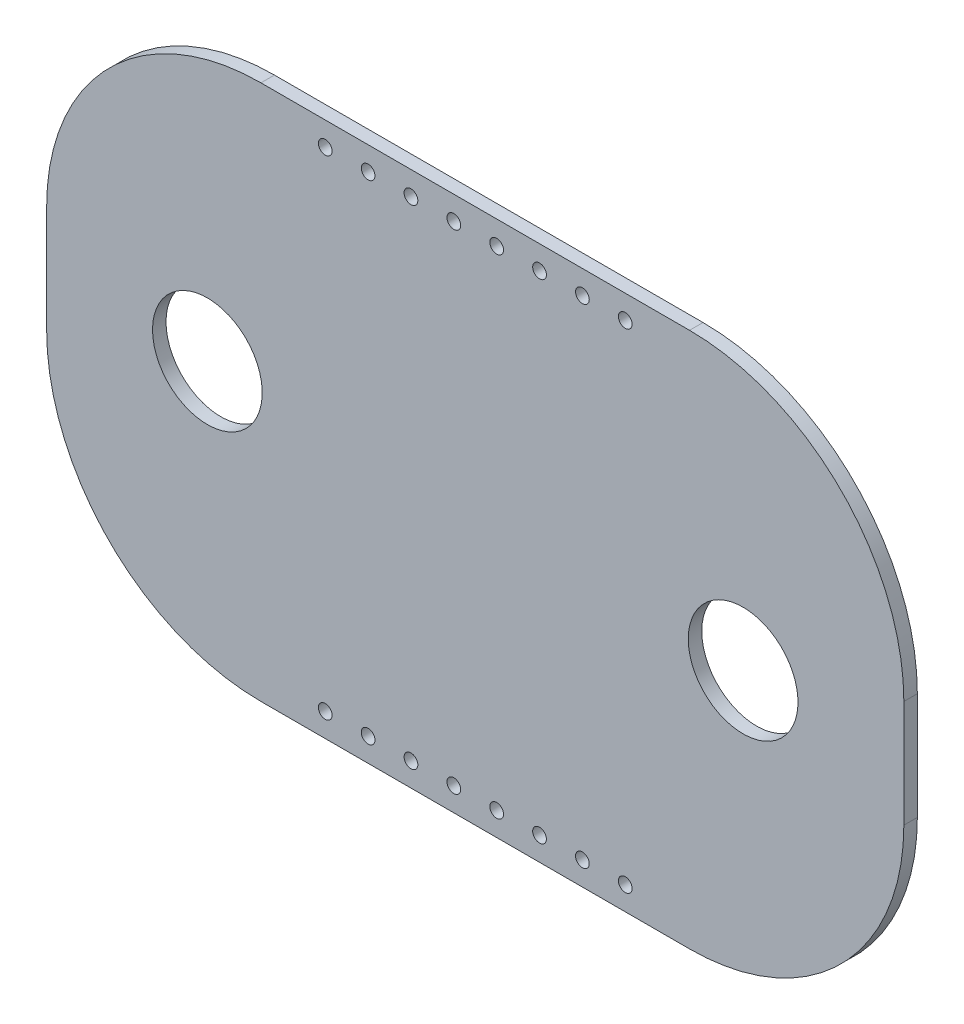
ISO-10303-21;
HEADER;
FILE_DESCRIPTION(('STEP AP214'),'2;1');
FILE_NAME('part.step','',(''),(''),'','','');
FILE_SCHEMA(('AUTOMOTIVE_DESIGN { 1 0 10303 214 1 1 1 1 }'));
ENDSEC;
DATA;
#1=APPLICATION_CONTEXT('core data for automotive mechanical design processes');
#2=APPLICATION_PROTOCOL_DEFINITION('international standard','automotive_design',2000,#1);
#3=PRODUCT_CONTEXT('',#1,'mechanical');
#4=PRODUCT('Part','Part','',(#3));
#5=PRODUCT_RELATED_PRODUCT_CATEGORY('part','',(#4));
#6=PRODUCT_DEFINITION_FORMATION('','',#4);
#7=PRODUCT_DEFINITION_CONTEXT('part definition',#1,'design');
#8=PRODUCT_DEFINITION('design','',#6,#7);
#9=PRODUCT_DEFINITION_SHAPE('','',#8);
#10=(LENGTH_UNIT() NAMED_UNIT(*) SI_UNIT(.MILLI.,.METRE.));
#11=(NAMED_UNIT(*) PLANE_ANGLE_UNIT() SI_UNIT($,.RADIAN.));
#12=(NAMED_UNIT(*) SI_UNIT($,.STERADIAN.) SOLID_ANGLE_UNIT());
#13=UNCERTAINTY_MEASURE_WITH_UNIT(LENGTH_MEASURE(1.E-05),#10,'distance_accuracy_value','');
#14=(GEOMETRIC_REPRESENTATION_CONTEXT(3) GLOBAL_UNCERTAINTY_ASSIGNED_CONTEXT((#13)) GLOBAL_UNIT_ASSIGNED_CONTEXT((#10,
#11,#12)) REPRESENTATION_CONTEXT('',''));
#15=CARTESIAN_POINT('',(0.,0.,0.));
#16=DIRECTION('',(0.,0.,1.));
#17=DIRECTION('',(1.,0.,0.));
#18=AXIS2_PLACEMENT_3D('',#15,#16,#17);
#19=CARTESIAN_POINT('',(0.,0.,0.800000051));
#20=DIRECTION('',(0.,0.,1.));
#21=DIRECTION('',(1.,0.,0.));
#22=AXIS2_PLACEMENT_3D('',#19,#20,#21);
#23=PLANE('',#22);
#24=CARTESIAN_POINT('',(14.605,30.353,0.800000051));
#25=DIRECTION('',(0.,0.,-1.));
#26=DIRECTION('',(-1.,0.,0.));
#27=AXIS2_PLACEMENT_3D('',#24,#25,#26);
#28=CIRCLE('',#27,0.406399999999999);
#29=CARTESIAN_POINT('',(14.1986,30.353,0.800000051));
#30=VERTEX_POINT('',#29);
#31=EDGE_CURVE('E494',#30,#30,#28,.T.);
#32=ORIENTED_EDGE('',*,*,#31,.T.);
#33=EDGE_LOOP('',(#32));
#34=FACE_BOUND('',#33,.T.);
#35=CARTESIAN_POINT('',(12.065,30.353,0.800000051));
#36=DIRECTION('',(0.,0.,-1.));
#37=DIRECTION('',(-1.,0.,0.));
#38=AXIS2_PLACEMENT_3D('',#35,#36,#37);
#39=CIRCLE('',#38,0.406399999999999);
#40=CARTESIAN_POINT('',(11.6586,30.353,0.800000051));
#41=VERTEX_POINT('',#40);
#42=EDGE_CURVE('E488',#41,#41,#39,.T.);
#43=ORIENTED_EDGE('',*,*,#42,.T.);
#44=EDGE_LOOP('',(#43));
#45=FACE_BOUND('',#44,.T.);
#46=CARTESIAN_POINT('',(9.525,30.353,0.800000051));
#47=DIRECTION('',(0.,0.,-1.));
#48=DIRECTION('',(-1.,0.,0.));
#49=AXIS2_PLACEMENT_3D('',#46,#47,#48);
#50=CIRCLE('',#49,0.406399999999999);
#51=CARTESIAN_POINT('',(9.1186,30.353,0.800000051));
#52=VERTEX_POINT('',#51);
#53=EDGE_CURVE('E481',#52,#52,#50,.T.);
#54=ORIENTED_EDGE('',*,*,#53,.T.);
#55=EDGE_LOOP('',(#54));
#56=FACE_BOUND('',#55,.T.);
#57=CARTESIAN_POINT('',(17.145,1.397,0.800000051));
#58=DIRECTION('',(0.,0.,-1.));
#59=DIRECTION('',(-1.,0.,0.));
#60=AXIS2_PLACEMENT_3D('',#57,#58,#59);
#61=CIRCLE('',#60,0.406400000000001);
#62=CARTESIAN_POINT('',(16.7386,1.397,0.800000051));
#63=VERTEX_POINT('',#62);
#64=EDGE_CURVE('E580',#63,#63,#61,.T.);
#65=ORIENTED_EDGE('',*,*,#64,.T.);
#66=EDGE_LOOP('',(#65));
#67=FACE_BOUND('',#66,.T.);
#68=CARTESIAN_POINT('',(19.685,1.397,0.800000051));
#69=DIRECTION('',(0.,0.,-1.));
#70=DIRECTION('',(-1.,0.,0.));
#71=AXIS2_PLACEMENT_3D('',#68,#69,#70);
#72=CIRCLE('',#71,0.406399999999997);
#73=CARTESIAN_POINT('',(19.2786,1.397,0.800000051));
#74=VERTEX_POINT('',#73);
#75=EDGE_CURVE('E586',#74,#74,#72,.T.);
#76=ORIENTED_EDGE('',*,*,#75,.T.);
#77=EDGE_LOOP('',(#76));
#78=FACE_BOUND('',#77,.T.);
#79=CARTESIAN_POINT('',(22.225,1.397,0.800000051));
#80=DIRECTION('',(0.,0.,-1.));
#81=DIRECTION('',(-1.,0.,0.));
#82=AXIS2_PLACEMENT_3D('',#79,#80,#81);
#83=CIRCLE('',#82,0.406399999999997);
#84=CARTESIAN_POINT('',(21.8186,1.397,0.800000051));
#85=VERTEX_POINT('',#84);
#86=EDGE_CURVE('E592',#85,#85,#83,.T.);
#87=ORIENTED_EDGE('',*,*,#86,.T.);
#88=EDGE_LOOP('',(#87));
#89=FACE_BOUND('',#88,.T.);
#90=CARTESIAN_POINT('',(24.765,1.397,0.800000051));
#91=DIRECTION('',(0.,0.,-1.));
#92=DIRECTION('',(-1.,0.,0.));
#93=AXIS2_PLACEMENT_3D('',#90,#91,#92);
#94=CIRCLE('',#93,0.406399999999997);
#95=CARTESIAN_POINT('',(24.3586,1.397,0.800000051));
#96=VERTEX_POINT('',#95);
#97=EDGE_CURVE('E597',#96,#96,#94,.T.);
#98=ORIENTED_EDGE('',*,*,#97,.T.);
#99=EDGE_LOOP('',(#98));
#100=FACE_BOUND('',#99,.T.);
#101=CARTESIAN_POINT('',(6.985,30.353,0.800000051));
#102=DIRECTION('',(0.,0.,-1.));
#103=DIRECTION('',(-1.,0.,0.));
#104=AXIS2_PLACEMENT_3D('',#101,#102,#103);
#105=CIRCLE('',#104,0.406399999999999);
#106=CARTESIAN_POINT('',(6.5786,30.353,0.800000051));
#107=VERTEX_POINT('',#106);
#108=EDGE_CURVE('E484',#107,#107,#105,.T.);
#109=ORIENTED_EDGE('',*,*,#108,.T.);
#110=EDGE_LOOP('',(#109));
#111=FACE_BOUND('',#110,.T.);
#112=CARTESIAN_POINT('',(31.75,15.875,0.800000051));
#113=DIRECTION('',(0.,0.,1.));
#114=DIRECTION('',(1.,0.,0.));
#115=AXIS2_PLACEMENT_3D('',#112,#113,#114);
#116=CIRCLE('',#115,3.2512);
#117=CARTESIAN_POINT('',(28.4988,15.875,0.800000051));
#118=VERTEX_POINT('',#117);
#119=EDGE_CURVE('E159',#118,#118,#116,.T.);
#120=ORIENTED_EDGE('',*,*,#119,.F.);
#121=EDGE_LOOP('',(#120));
#122=FACE_BOUND('',#121,.T.);
#123=CARTESIAN_POINT('',(0.,15.875,0.800000051));
#124=DIRECTION('',(0.,0.,1.));
#125=DIRECTION('',(1.,0.,0.));
#126=AXIS2_PLACEMENT_3D('',#123,#124,#125);
#127=CIRCLE('',#126,3.2512);
#128=CARTESIAN_POINT('',(-3.2512,15.875,0.800000051));
#129=VERTEX_POINT('',#128);
#130=EDGE_CURVE('E507',#129,#129,#127,.T.);
#131=ORIENTED_EDGE('',*,*,#130,.F.);
#132=EDGE_LOOP('',(#131));
#133=FACE_BOUND('',#132,.T.);
#134=DIRECTION('',(0.,1.,0.));
#135=VECTOR('',#134,1.);
#136=CARTESIAN_POINT('',(-9.52500000000001,0.,0.800000051));
#137=LINE('',#136,#135);
#138=CARTESIAN_POINT('',(-9.52500000000001,12.7000000000001,0.800000051));
#139=VERTEX_POINT('',#138);
#140=CARTESIAN_POINT('',(-9.52500000000001,19.0499999999999,0.800000051));
#141=VERTEX_POINT('',#140);
#142=EDGE_CURVE('E510',#139,#141,#137,.T.);
#143=ORIENTED_EDGE('',*,*,#142,.F.);
#144=CARTESIAN_POINT('',(3.17499999999999,12.7,0.800000051));
#145=DIRECTION('',(0.,0.,1.));
#146=DIRECTION('',(1.,0.,0.));
#147=AXIS2_PLACEMENT_3D('',#144,#145,#146);
#148=CIRCLE('',#147,12.7);
#149=CARTESIAN_POINT('',(3.17500000000008,0.,0.800000051));
#150=VERTEX_POINT('',#149);
#151=EDGE_CURVE('E512',#139,#150,#148,.T.);
#152=ORIENTED_EDGE('',*,*,#151,.T.);
#153=DIRECTION('',(1.,0.,0.));
#154=VECTOR('',#153,1.);
#155=CARTESIAN_POINT('',(0.,0.,0.800000051));
#156=LINE('',#155,#154);
#157=CARTESIAN_POINT('',(28.5749999999999,0.,0.800000051));
#158=VERTEX_POINT('',#157);
#159=EDGE_CURVE('E171',#150,#158,#156,.T.);
#160=ORIENTED_EDGE('',*,*,#159,.T.);
#161=CARTESIAN_POINT('',(28.575,12.7,0.800000051));
#162=DIRECTION('',(0.,0.,1.));
#163=DIRECTION('',(1.,0.,0.));
#164=AXIS2_PLACEMENT_3D('',#161,#162,#163);
#165=CIRCLE('',#164,12.7);
#166=CARTESIAN_POINT('',(41.275,12.7000000000001,0.800000051));
#167=VERTEX_POINT('',#166);
#168=EDGE_CURVE('E515',#167,#158,#165,.F.);
#169=ORIENTED_EDGE('',*,*,#168,.F.);
#170=DIRECTION('',(0.,-1.,0.));
#171=VECTOR('',#170,1.);
#172=CARTESIAN_POINT('',(41.275,0.,0.800000051));
#173=LINE('',#172,#171);
#174=CARTESIAN_POINT('',(41.275,19.0499999999999,0.800000051));
#175=VERTEX_POINT('',#174);
#176=EDGE_CURVE('E124',#175,#167,#173,.T.);
#177=ORIENTED_EDGE('',*,*,#176,.F.);
#178=CARTESIAN_POINT('',(28.575,19.05,0.800000051));
#179=DIRECTION('',(0.,0.,1.));
#180=DIRECTION('',(1.,0.,0.));
#181=AXIS2_PLACEMENT_3D('',#178,#179,#180);
#182=CIRCLE('',#181,12.7);
#183=CARTESIAN_POINT('',(28.5749999999999,31.75,0.800000051));
#184=VERTEX_POINT('',#183);
#185=EDGE_CURVE('E107',#184,#175,#182,.F.);
#186=ORIENTED_EDGE('',*,*,#185,.F.);
#187=DIRECTION('',(1.,0.,0.));
#188=VECTOR('',#187,1.);
#189=CARTESIAN_POINT('',(0.,31.75,0.800000051));
#190=LINE('',#189,#188);
#191=CARTESIAN_POINT('',(3.17500000000008,31.75,0.800000051));
#192=VERTEX_POINT('',#191);
#193=EDGE_CURVE('E121',#192,#184,#190,.T.);
#194=ORIENTED_EDGE('',*,*,#193,.F.);
#195=CARTESIAN_POINT('',(3.17499999999999,19.05,0.800000051));
#196=DIRECTION('',(0.,0.,1.));
#197=DIRECTION('',(1.,0.,0.));
#198=AXIS2_PLACEMENT_3D('',#195,#196,#197);
#199=CIRCLE('',#198,12.7);
#200=EDGE_CURVE('E127',#141,#192,#199,.F.);
#201=ORIENTED_EDGE('',*,*,#200,.F.);
#202=EDGE_LOOP('',(#143,#152,#160,#169,#177,#186,#194,#201));
#203=FACE_BOUND('',#202,.T.);
#204=CARTESIAN_POINT('',(14.605,1.397,0.800000051));
#205=DIRECTION('',(0.,0.,1.));
#206=DIRECTION('',(1.,0.,0.));
#207=AXIS2_PLACEMENT_3D('',#204,#205,#206);
#208=CIRCLE('',#207,0.406399999999999);
#209=CARTESIAN_POINT('',(15.0114,1.397,0.800000051));
#210=VERTEX_POINT('',#209);
#211=EDGE_CURVE('E574',#210,#210,#208,.T.);
#212=ORIENTED_EDGE('',*,*,#211,.F.);
#213=EDGE_LOOP('',(#212));
#214=FACE_BOUND('',#213,.T.);
#215=CARTESIAN_POINT('',(12.065,1.397,0.800000051));
#216=DIRECTION('',(0.,0.,1.));
#217=DIRECTION('',(1.,0.,0.));
#218=AXIS2_PLACEMENT_3D('',#215,#216,#217);
#219=CIRCLE('',#218,0.406399999999999);
#220=CARTESIAN_POINT('',(12.4714,1.397,0.800000051));
#221=VERTEX_POINT('',#220);
#222=EDGE_CURVE('E566',#221,#221,#219,.T.);
#223=ORIENTED_EDGE('',*,*,#222,.F.);
#224=EDGE_LOOP('',(#223));
#225=FACE_BOUND('',#224,.T.);
#226=CARTESIAN_POINT('',(9.52499999999999,1.397,0.800000051));
#227=DIRECTION('',(0.,0.,1.));
#228=DIRECTION('',(1.,0.,0.));
#229=AXIS2_PLACEMENT_3D('',#226,#227,#228);
#230=CIRCLE('',#229,0.406399999999999);
#231=CARTESIAN_POINT('',(9.93139999999999,1.397,0.800000051));
#232=VERTEX_POINT('',#231);
#233=EDGE_CURVE('E557',#232,#232,#230,.T.);
#234=ORIENTED_EDGE('',*,*,#233,.F.);
#235=EDGE_LOOP('',(#234));
#236=FACE_BOUND('',#235,.T.);
#237=CARTESIAN_POINT('',(17.145,30.353,0.800000051));
#238=DIRECTION('',(0.,0.,1.));
#239=DIRECTION('',(1.,0.,0.));
#240=AXIS2_PLACEMENT_3D('',#237,#238,#239);
#241=CIRCLE('',#240,0.406400000000001);
#242=CARTESIAN_POINT('',(17.5514,30.353,0.800000051));
#243=VERTEX_POINT('',#242);
#244=EDGE_CURVE('E467',#243,#243,#241,.T.);
#245=ORIENTED_EDGE('',*,*,#244,.F.);
#246=EDGE_LOOP('',(#245));
#247=FACE_BOUND('',#246,.T.);
#248=CARTESIAN_POINT('',(6.98499999999999,1.397,0.800000051));
#249=DIRECTION('',(0.,0.,1.));
#250=DIRECTION('',(1.,0.,0.));
#251=AXIS2_PLACEMENT_3D('',#248,#249,#250);
#252=CIRCLE('',#251,0.406399999999999);
#253=CARTESIAN_POINT('',(7.39139999999999,1.397,0.800000051));
#254=VERTEX_POINT('',#253);
#255=EDGE_CURVE('E541',#254,#254,#252,.T.);
#256=ORIENTED_EDGE('',*,*,#255,.F.);
#257=EDGE_LOOP('',(#256));
#258=FACE_BOUND('',#257,.T.);
#259=CARTESIAN_POINT('',(24.765,30.353,0.800000051));
#260=DIRECTION('',(0.,0.,1.));
#261=DIRECTION('',(1.,0.,0.));
#262=AXIS2_PLACEMENT_3D('',#259,#260,#261);
#263=CIRCLE('',#262,0.406399999999997);
#264=CARTESIAN_POINT('',(25.1714,30.353,0.800000051));
#265=VERTEX_POINT('',#264);
#266=EDGE_CURVE('E480',#265,#265,#263,.T.);
#267=ORIENTED_EDGE('',*,*,#266,.F.);
#268=EDGE_LOOP('',(#267));
#269=FACE_BOUND('',#268,.T.);
#270=CARTESIAN_POINT('',(22.225,30.353,0.800000051));
#271=DIRECTION('',(0.,0.,1.));
#272=DIRECTION('',(1.,0.,0.));
#273=AXIS2_PLACEMENT_3D('',#270,#271,#272);
#274=CIRCLE('',#273,0.406399999999997);
#275=CARTESIAN_POINT('',(22.6314,30.353,0.800000051));
#276=VERTEX_POINT('',#275);
#277=EDGE_CURVE('E469',#276,#276,#274,.T.);
#278=ORIENTED_EDGE('',*,*,#277,.F.);
#279=EDGE_LOOP('',(#278));
#280=FACE_BOUND('',#279,.T.);
#281=CARTESIAN_POINT('',(19.685,30.353,0.800000051));
#282=DIRECTION('',(0.,0.,1.));
#283=DIRECTION('',(1.,0.,0.));
#284=AXIS2_PLACEMENT_3D('',#281,#282,#283);
#285=CIRCLE('',#284,0.406399999999997);
#286=CARTESIAN_POINT('',(20.0914,30.353,0.800000051));
#287=VERTEX_POINT('',#286);
#288=EDGE_CURVE('E462',#287,#287,#285,.T.);
#289=ORIENTED_EDGE('',*,*,#288,.F.);
#290=EDGE_LOOP('',(#289));
#291=FACE_BOUND('',#290,.T.);
#292=ADVANCED_FACE('F37',(#34,#45,#56,#67,#78,#89,#100,#111,#122,#133,#203,#214,#225,#236,#247,
#258,#269,#280,#291),#23,.T.);
#293=CARTESIAN_POINT('',(0.,0.,0.));
#294=DIRECTION('',(0.,0.,1.));
#295=DIRECTION('',(1.,0.,0.));
#296=AXIS2_PLACEMENT_3D('',#293,#294,#295);
#297=PLANE('',#296);
#298=CARTESIAN_POINT('',(22.225,30.353,0.));
#299=DIRECTION('',(0.,0.,1.));
#300=DIRECTION('',(1.,0.,0.));
#301=AXIS2_PLACEMENT_3D('',#298,#299,#300);
#302=CIRCLE('',#301,0.406399999999997);
#303=CARTESIAN_POINT('',(22.6314,30.353,0.));
#304=VERTEX_POINT('',#303);
#305=EDGE_CURVE('E477',#304,#304,#302,.T.);
#306=ORIENTED_EDGE('',*,*,#305,.T.);
#307=EDGE_LOOP('',(#306));
#308=FACE_BOUND('',#307,.T.);
#309=CARTESIAN_POINT('',(6.98499999999999,1.397,0.));
#310=DIRECTION('',(0.,0.,1.));
#311=DIRECTION('',(1.,0.,0.));
#312=AXIS2_PLACEMENT_3D('',#309,#310,#311);
#313=CIRCLE('',#312,0.406399999999999);
#314=CARTESIAN_POINT('',(7.39139999999999,1.397,0.));
#315=VERTEX_POINT('',#314);
#316=EDGE_CURVE('E472',#315,#315,#313,.T.);
#317=ORIENTED_EDGE('',*,*,#316,.T.);
#318=EDGE_LOOP('',(#317));
#319=FACE_BOUND('',#318,.T.);
#320=CARTESIAN_POINT('',(9.52499999999999,1.397,0.));
#321=DIRECTION('',(0.,0.,1.));
#322=DIRECTION('',(1.,0.,0.));
#323=AXIS2_PLACEMENT_3D('',#320,#321,#322);
#324=CIRCLE('',#323,0.406399999999999);
#325=CARTESIAN_POINT('',(9.93139999999999,1.397,0.));
#326=VERTEX_POINT('',#325);
#327=EDGE_CURVE('E561',#326,#326,#324,.T.);
#328=ORIENTED_EDGE('',*,*,#327,.T.);
#329=EDGE_LOOP('',(#328));
#330=FACE_BOUND('',#329,.T.);
#331=CARTESIAN_POINT('',(14.605,1.397,0.));
#332=DIRECTION('',(0.,0.,1.));
#333=DIRECTION('',(1.,0.,0.));
#334=AXIS2_PLACEMENT_3D('',#331,#332,#333);
#335=CIRCLE('',#334,0.406399999999999);
#336=CARTESIAN_POINT('',(15.0114,1.397,0.));
#337=VERTEX_POINT('',#336);
#338=EDGE_CURVE('E577',#337,#337,#335,.T.);
#339=ORIENTED_EDGE('',*,*,#338,.T.);
#340=EDGE_LOOP('',(#339));
#341=FACE_BOUND('',#340,.T.);
#342=CARTESIAN_POINT('',(17.145,1.397,0.));
#343=DIRECTION('',(0.,0.,-1.));
#344=DIRECTION('',(-1.,0.,0.));
#345=AXIS2_PLACEMENT_3D('',#342,#343,#344);
#346=CIRCLE('',#345,0.406400000000001);
#347=CARTESIAN_POINT('',(16.7386,1.397,0.));
#348=VERTEX_POINT('',#347);
#349=EDGE_CURVE('E583',#348,#348,#346,.T.);
#350=ORIENTED_EDGE('',*,*,#349,.F.);
#351=EDGE_LOOP('',(#350));
#352=FACE_BOUND('',#351,.T.);
#353=CARTESIAN_POINT('',(19.685,1.397,0.));
#354=DIRECTION('',(0.,0.,-1.));
#355=DIRECTION('',(-1.,0.,0.));
#356=AXIS2_PLACEMENT_3D('',#353,#354,#355);
#357=CIRCLE('',#356,0.406399999999997);
#358=CARTESIAN_POINT('',(19.2786,1.397,0.));
#359=VERTEX_POINT('',#358);
#360=EDGE_CURVE('E589',#359,#359,#357,.T.);
#361=ORIENTED_EDGE('',*,*,#360,.F.);
#362=EDGE_LOOP('',(#361));
#363=FACE_BOUND('',#362,.T.);
#364=CARTESIAN_POINT('',(22.225,1.397,0.));
#365=DIRECTION('',(0.,0.,-1.));
#366=DIRECTION('',(-1.,0.,0.));
#367=AXIS2_PLACEMENT_3D('',#364,#365,#366);
#368=CIRCLE('',#367,0.406399999999997);
#369=CARTESIAN_POINT('',(21.8186,1.397,0.));
#370=VERTEX_POINT('',#369);
#371=EDGE_CURVE('E595',#370,#370,#368,.T.);
#372=ORIENTED_EDGE('',*,*,#371,.F.);
#373=EDGE_LOOP('',(#372));
#374=FACE_BOUND('',#373,.T.);
#375=CARTESIAN_POINT('',(24.765,1.397,0.));
#376=DIRECTION('',(0.,0.,-1.));
#377=DIRECTION('',(-1.,0.,0.));
#378=AXIS2_PLACEMENT_3D('',#375,#376,#377);
#379=CIRCLE('',#378,0.406399999999997);
#380=CARTESIAN_POINT('',(24.3586,1.397,0.));
#381=VERTEX_POINT('',#380);
#382=EDGE_CURVE('E553',#381,#381,#379,.T.);
#383=ORIENTED_EDGE('',*,*,#382,.F.);
#384=EDGE_LOOP('',(#383));
#385=FACE_BOUND('',#384,.T.);
#386=CARTESIAN_POINT('',(6.985,30.353,0.));
#387=DIRECTION('',(0.,0.,-1.));
#388=DIRECTION('',(-1.,0.,0.));
#389=AXIS2_PLACEMENT_3D('',#386,#387,#388);
#390=CIRCLE('',#389,0.406399999999999);
#391=CARTESIAN_POINT('',(6.5786,30.353,0.));
#392=VERTEX_POINT('',#391);
#393=EDGE_CURVE('E136',#392,#392,#390,.T.);
#394=ORIENTED_EDGE('',*,*,#393,.F.);
#395=EDGE_LOOP('',(#394));
#396=FACE_BOUND('',#395,.T.);
#397=CARTESIAN_POINT('',(31.75,15.875,0.));
#398=DIRECTION('',(0.,0.,1.));
#399=DIRECTION('',(1.,0.,0.));
#400=AXIS2_PLACEMENT_3D('',#397,#398,#399);
#401=CIRCLE('',#400,3.2512);
#402=CARTESIAN_POINT('',(28.4988,15.875,0.));
#403=VERTEX_POINT('',#402);
#404=EDGE_CURVE('E132',#403,#403,#401,.T.);
#405=ORIENTED_EDGE('',*,*,#404,.T.);
#406=EDGE_LOOP('',(#405));
#407=FACE_BOUND('',#406,.T.);
#408=CARTESIAN_POINT('',(0.,15.875,0.));
#409=DIRECTION('',(0.,0.,1.));
#410=DIRECTION('',(1.,0.,0.));
#411=AXIS2_PLACEMENT_3D('',#408,#409,#410);
#412=CIRCLE('',#411,3.2512);
#413=CARTESIAN_POINT('',(-3.2512,15.875,0.));
#414=VERTEX_POINT('',#413);
#415=EDGE_CURVE('E135',#414,#414,#412,.T.);
#416=ORIENTED_EDGE('',*,*,#415,.T.);
#417=EDGE_LOOP('',(#416));
#418=FACE_BOUND('',#417,.T.);
#419=DIRECTION('',(0.,1.,0.));
#420=VECTOR('',#419,1.);
#421=CARTESIAN_POINT('',(-9.52500000000001,0.,0.));
#422=LINE('',#421,#420);
#423=CARTESIAN_POINT('',(-9.52500000000001,12.7000000000001,0.));
#424=VERTEX_POINT('',#423);
#425=CARTESIAN_POINT('',(-9.52500000000001,19.0499999999999,0.));
#426=VERTEX_POINT('',#425);
#427=EDGE_CURVE('E139',#424,#426,#422,.T.);
#428=ORIENTED_EDGE('',*,*,#427,.T.);
#429=CARTESIAN_POINT('',(3.17499999999999,19.05,0.));
#430=DIRECTION('',(0.,0.,1.));
#431=DIRECTION('',(1.,0.,0.));
#432=AXIS2_PLACEMENT_3D('',#429,#430,#431);
#433=CIRCLE('',#432,12.7);
#434=CARTESIAN_POINT('',(3.17500000000008,31.75,0.));
#435=VERTEX_POINT('',#434);
#436=EDGE_CURVE('E156',#426,#435,#433,.F.);
#437=ORIENTED_EDGE('',*,*,#436,.T.);
#438=DIRECTION('',(1.,0.,0.));
#439=VECTOR('',#438,1.);
#440=CARTESIAN_POINT('',(0.,31.75,0.));
#441=LINE('',#440,#439);
#442=CARTESIAN_POINT('',(28.5749999999999,31.75,0.));
#443=VERTEX_POINT('',#442);
#444=EDGE_CURVE('E154',#435,#443,#441,.T.);
#445=ORIENTED_EDGE('',*,*,#444,.T.);
#446=CARTESIAN_POINT('',(28.575,19.05,0.));
#447=DIRECTION('',(0.,0.,1.));
#448=DIRECTION('',(1.,0.,0.));
#449=AXIS2_PLACEMENT_3D('',#446,#447,#448);
#450=CIRCLE('',#449,12.7);
#451=CARTESIAN_POINT('',(41.275,19.0499999999999,0.));
#452=VERTEX_POINT('',#451);
#453=EDGE_CURVE('E109',#443,#452,#450,.F.);
#454=ORIENTED_EDGE('',*,*,#453,.T.);
#455=DIRECTION('',(0.,-1.,0.));
#456=VECTOR('',#455,1.);
#457=CARTESIAN_POINT('',(41.275,0.,0.));
#458=LINE('',#457,#456);
#459=CARTESIAN_POINT('',(41.275,12.7000000000001,0.));
#460=VERTEX_POINT('',#459);
#461=EDGE_CURVE('E150',#452,#460,#458,.T.);
#462=ORIENTED_EDGE('',*,*,#461,.T.);
#463=CARTESIAN_POINT('',(28.575,12.7,0.));
#464=DIRECTION('',(0.,0.,1.));
#465=DIRECTION('',(1.,0.,0.));
#466=AXIS2_PLACEMENT_3D('',#463,#464,#465);
#467=CIRCLE('',#466,12.7);
#468=CARTESIAN_POINT('',(28.5749999999999,0.,0.));
#469=VERTEX_POINT('',#468);
#470=EDGE_CURVE('E147',#460,#469,#467,.F.);
#471=ORIENTED_EDGE('',*,*,#470,.T.);
#472=DIRECTION('',(1.,0.,0.));
#473=VECTOR('',#472,1.);
#474=CARTESIAN_POINT('',(0.,0.,0.));
#475=LINE('',#474,#473);
#476=CARTESIAN_POINT('',(3.17500000000008,0.,0.));
#477=VERTEX_POINT('',#476);
#478=EDGE_CURVE('E144',#477,#469,#475,.T.);
#479=ORIENTED_EDGE('',*,*,#478,.F.);
#480=CARTESIAN_POINT('',(3.17499999999999,12.7,0.));
#481=DIRECTION('',(0.,0.,1.));
#482=DIRECTION('',(1.,0.,0.));
#483=AXIS2_PLACEMENT_3D('',#480,#481,#482);
#484=CIRCLE('',#483,12.7);
#485=EDGE_CURVE('E141',#424,#477,#484,.T.);
#486=ORIENTED_EDGE('',*,*,#485,.F.);
#487=EDGE_LOOP('',(#428,#437,#445,#454,#462,#471,#479,#486));
#488=FACE_BOUND('',#487,.T.);
#489=CARTESIAN_POINT('',(12.065,1.397,0.));
#490=DIRECTION('',(0.,0.,1.));
#491=DIRECTION('',(1.,0.,0.));
#492=AXIS2_PLACEMENT_3D('',#489,#490,#491);
#493=CIRCLE('',#492,0.406399999999999);
#494=CARTESIAN_POINT('',(12.4714,1.397,0.));
#495=VERTEX_POINT('',#494);
#496=EDGE_CURVE('E571',#495,#495,#493,.T.);
#497=ORIENTED_EDGE('',*,*,#496,.T.);
#498=EDGE_LOOP('',(#497));
#499=FACE_BOUND('',#498,.T.);
#500=CARTESIAN_POINT('',(9.525,30.353,0.));
#501=DIRECTION('',(0.,0.,-1.));
#502=DIRECTION('',(-1.,0.,0.));
#503=AXIS2_PLACEMENT_3D('',#500,#501,#502);
#504=CIRCLE('',#503,0.406399999999999);
#505=CARTESIAN_POINT('',(9.1186,30.353,0.));
#506=VERTEX_POINT('',#505);
#507=EDGE_CURVE('E485',#506,#506,#504,.T.);
#508=ORIENTED_EDGE('',*,*,#507,.F.);
#509=EDGE_LOOP('',(#508));
#510=FACE_BOUND('',#509,.T.);
#511=CARTESIAN_POINT('',(12.065,30.353,0.));
#512=DIRECTION('',(0.,0.,-1.));
#513=DIRECTION('',(-1.,0.,0.));
#514=AXIS2_PLACEMENT_3D('',#511,#512,#513);
#515=CIRCLE('',#514,0.406399999999999);
#516=CARTESIAN_POINT('',(11.6586,30.353,0.));
#517=VERTEX_POINT('',#516);
#518=EDGE_CURVE('E491',#517,#517,#515,.T.);
#519=ORIENTED_EDGE('',*,*,#518,.F.);
#520=EDGE_LOOP('',(#519));
#521=FACE_BOUND('',#520,.T.);
#522=CARTESIAN_POINT('',(14.605,30.353,0.));
#523=DIRECTION('',(0.,0.,-1.));
#524=DIRECTION('',(-1.,0.,0.));
#525=AXIS2_PLACEMENT_3D('',#522,#523,#524);
#526=CIRCLE('',#525,0.406399999999999);
#527=CARTESIAN_POINT('',(14.1986,30.353,0.));
#528=VERTEX_POINT('',#527);
#529=EDGE_CURVE('E496',#528,#528,#526,.T.);
#530=ORIENTED_EDGE('',*,*,#529,.F.);
#531=EDGE_LOOP('',(#530));
#532=FACE_BOUND('',#531,.T.);
#533=CARTESIAN_POINT('',(17.145,30.353,0.));
#534=DIRECTION('',(0.,0.,1.));
#535=DIRECTION('',(1.,0.,0.));
#536=AXIS2_PLACEMENT_3D('',#533,#534,#535);
#537=CIRCLE('',#536,0.406400000000001);
#538=CARTESIAN_POINT('',(17.5514,30.353,0.));
#539=VERTEX_POINT('',#538);
#540=EDGE_CURVE('E464',#539,#539,#537,.T.);
#541=ORIENTED_EDGE('',*,*,#540,.T.);
#542=EDGE_LOOP('',(#541));
#543=FACE_BOUND('',#542,.T.);
#544=CARTESIAN_POINT('',(24.765,30.353,0.));
#545=DIRECTION('',(0.,0.,1.));
#546=DIRECTION('',(1.,0.,0.));
#547=AXIS2_PLACEMENT_3D('',#544,#545,#546);
#548=CIRCLE('',#547,0.406399999999997);
#549=CARTESIAN_POINT('',(25.1714,30.353,0.));
#550=VERTEX_POINT('',#549);
#551=EDGE_CURVE('E548',#550,#550,#548,.T.);
#552=ORIENTED_EDGE('',*,*,#551,.T.);
#553=EDGE_LOOP('',(#552));
#554=FACE_BOUND('',#553,.T.);
#555=CARTESIAN_POINT('',(19.685,30.353,0.));
#556=DIRECTION('',(0.,0.,1.));
#557=DIRECTION('',(1.,0.,0.));
#558=AXIS2_PLACEMENT_3D('',#555,#556,#557);
#559=CIRCLE('',#558,0.406399999999997);
#560=CARTESIAN_POINT('',(20.0914,30.353,0.));
#561=VERTEX_POINT('',#560);
#562=EDGE_CURVE('E459',#561,#561,#559,.T.);
#563=ORIENTED_EDGE('',*,*,#562,.T.);
#564=EDGE_LOOP('',(#563));
#565=FACE_BOUND('',#564,.T.);
#566=ADVANCED_FACE('F177',(#308,#319,#330,#341,#352,#363,#374,#385,#396,#407,#418,#488,#499,
#510,#521,#532,#543,#554,#565),#297,.F.);
#567=CARTESIAN_POINT('',(-9.52500000000001,0.,0.800000051));
#568=DIRECTION('',(-1.,0.,0.));
#569=DIRECTION('',(0.,0.,1.));
#570=AXIS2_PLACEMENT_3D('',#567,#568,#569);
#571=PLANE('',#570);
#572=ORIENTED_EDGE('',*,*,#427,.F.);
#573=DIRECTION('',(0.,0.,-1.));
#574=VECTOR('',#573,1.);
#575=CARTESIAN_POINT('',(-9.52500000000001,12.7000000000001,0.800000051));
#576=LINE('',#575,#574);
#577=EDGE_CURVE('E11',#139,#424,#576,.T.);
#578=ORIENTED_EDGE('',*,*,#577,.F.);
#579=ORIENTED_EDGE('',*,*,#142,.T.);
#580=DIRECTION('',(0.,0.,-1.));
#581=VECTOR('',#580,1.);
#582=CARTESIAN_POINT('',(-9.52500000000001,19.0499999999999,0.800000051));
#583=LINE('',#582,#581);
#584=EDGE_CURVE('E54',#141,#426,#583,.T.);
#585=ORIENTED_EDGE('',*,*,#584,.T.);
#586=EDGE_LOOP('',(#572,#578,#579,#585));
#587=FACE_BOUND('',#586,.T.);
#588=ADVANCED_FACE('F179',(#587),#571,.T.);
#589=CARTESIAN_POINT('',(3.17499999999999,12.7,0.800000051));
#590=DIRECTION('',(0.,0.,-1.));
#591=DIRECTION('',(-1.,0.,0.));
#592=AXIS2_PLACEMENT_3D('',#589,#590,#591);
#593=CYLINDRICAL_SURFACE('',#592,12.7);
#594=ORIENTED_EDGE('',*,*,#485,.T.);
#595=DIRECTION('',(0.,0.,-1.));
#596=VECTOR('',#595,1.);
#597=CARTESIAN_POINT('',(3.17500000000008,0.,0.800000051));
#598=LINE('',#597,#596);
#599=EDGE_CURVE('E46',#150,#477,#598,.T.);
#600=ORIENTED_EDGE('',*,*,#599,.F.);
#601=ORIENTED_EDGE('',*,*,#151,.F.);
#602=ORIENTED_EDGE('',*,*,#577,.T.);
#603=EDGE_LOOP('',(#594,#600,#601,#602));
#604=FACE_BOUND('',#603,.T.);
#605=ADVANCED_FACE('F175',(#604),#593,.T.);
#606=CARTESIAN_POINT('',(0.,0.,0.800000051));
#607=DIRECTION('',(0.,1.,0.));
#608=DIRECTION('',(-1.,0.,0.));
#609=AXIS2_PLACEMENT_3D('',#606,#607,#608);
#610=PLANE('',#609);
#611=ORIENTED_EDGE('',*,*,#478,.T.);
#612=DIRECTION('',(0.,0.,-1.));
#613=VECTOR('',#612,1.);
#614=CARTESIAN_POINT('',(28.5749999999999,0.,0.800000051));
#615=LINE('',#614,#613);
#616=EDGE_CURVE('E165',#158,#469,#615,.T.);
#617=ORIENTED_EDGE('',*,*,#616,.F.);
#618=ORIENTED_EDGE('',*,*,#159,.F.);
#619=ORIENTED_EDGE('',*,*,#599,.T.);
#620=EDGE_LOOP('',(#611,#617,#618,#619));
#621=FACE_BOUND('',#620,.T.);
#622=ADVANCED_FACE('F169',(#621),#610,.F.);
#623=CARTESIAN_POINT('',(28.575,12.7,0.800000051));
#624=DIRECTION('',(0.,0.,-1.));
#625=DIRECTION('',(-1.,0.,0.));
#626=AXIS2_PLACEMENT_3D('',#623,#624,#625);
#627=CYLINDRICAL_SURFACE('',#626,12.7);
#628=ORIENTED_EDGE('',*,*,#470,.F.);
#629=DIRECTION('',(0.,0.,-1.));
#630=VECTOR('',#629,1.);
#631=CARTESIAN_POINT('',(41.275,12.7000000000001,0.800000051));
#632=LINE('',#631,#630);
#633=EDGE_CURVE('E163',#167,#460,#632,.T.);
#634=ORIENTED_EDGE('',*,*,#633,.F.);
#635=ORIENTED_EDGE('',*,*,#168,.T.);
#636=ORIENTED_EDGE('',*,*,#616,.T.);
#637=EDGE_LOOP('',(#628,#634,#635,#636));
#638=FACE_BOUND('',#637,.T.);
#639=ADVANCED_FACE('F211',(#638),#627,.T.);
#640=CARTESIAN_POINT('',(41.275,0.,0.800000051));
#641=DIRECTION('',(1.,0.,0.));
#642=DIRECTION('',(0.,0.,-1.));
#643=AXIS2_PLACEMENT_3D('',#640,#641,#642);
#644=PLANE('',#643);
#645=ORIENTED_EDGE('',*,*,#461,.F.);
#646=DIRECTION('',(0.,0.,-1.));
#647=VECTOR('',#646,1.);
#648=CARTESIAN_POINT('',(41.275,19.0499999999999,0.800000051));
#649=LINE('',#648,#647);
#650=EDGE_CURVE('E113',#175,#452,#649,.T.);
#651=ORIENTED_EDGE('',*,*,#650,.F.);
#652=ORIENTED_EDGE('',*,*,#176,.T.);
#653=ORIENTED_EDGE('',*,*,#633,.T.);
#654=EDGE_LOOP('',(#645,#651,#652,#653));
#655=FACE_BOUND('',#654,.T.);
#656=ADVANCED_FACE('F208',(#655),#644,.T.);
#657=CARTESIAN_POINT('',(28.575,19.05,0.800000051));
#658=DIRECTION('',(0.,0.,-1.));
#659=DIRECTION('',(-1.,0.,0.));
#660=AXIS2_PLACEMENT_3D('',#657,#658,#659);
#661=CYLINDRICAL_SURFACE('',#660,12.7);
#662=ORIENTED_EDGE('',*,*,#453,.F.);
#663=DIRECTION('',(0.,0.,-1.));
#664=VECTOR('',#663,1.);
#665=CARTESIAN_POINT('',(28.5749999999999,31.75,0.800000051));
#666=LINE('',#665,#664);
#667=EDGE_CURVE('E104',#184,#443,#666,.T.);
#668=ORIENTED_EDGE('',*,*,#667,.F.);
#669=ORIENTED_EDGE('',*,*,#185,.T.);
#670=ORIENTED_EDGE('',*,*,#650,.T.);
#671=EDGE_LOOP('',(#662,#668,#669,#670));
#672=FACE_BOUND('',#671,.T.);
#673=ADVANCED_FACE('F106',(#672),#661,.T.);
#674=CARTESIAN_POINT('',(0.,31.75,0.800000051));
#675=DIRECTION('',(0.,1.,0.));
#676=DIRECTION('',(0.,0.,1.));
#677=AXIS2_PLACEMENT_3D('',#674,#675,#676);
#678=PLANE('',#677);
#679=ORIENTED_EDGE('',*,*,#444,.F.);
#680=DIRECTION('',(0.,0.,-1.));
#681=VECTOR('',#680,1.);
#682=CARTESIAN_POINT('',(3.17500000000008,31.75,0.800000051));
#683=LINE('',#682,#681);
#684=EDGE_CURVE('E79',#192,#435,#683,.T.);
#685=ORIENTED_EDGE('',*,*,#684,.F.);
#686=ORIENTED_EDGE('',*,*,#193,.T.);
#687=ORIENTED_EDGE('',*,*,#667,.T.);
#688=EDGE_LOOP('',(#679,#685,#686,#687));
#689=FACE_BOUND('',#688,.T.);
#690=ADVANCED_FACE('F126',(#689),#678,.T.);
#691=CARTESIAN_POINT('',(0.,15.875,0.800000051));
#692=DIRECTION('',(0.,0.,-1.));
#693=DIRECTION('',(-1.,0.,0.));
#694=AXIS2_PLACEMENT_3D('',#691,#692,#693);
#695=CYLINDRICAL_SURFACE('',#694,3.2512);
#696=CARTESIAN_POINT('',(-3.2512,15.875,0.800000051));
#697=CARTESIAN_POINT('',(-3.2512,15.875,0.791666717135417));
#698=CARTESIAN_POINT('',(-3.2512,15.875,0.783333383270833));
#699=CARTESIAN_POINT('',(-3.2512,15.875,0.766666715541667));
#700=CARTESIAN_POINT('',(-3.2512,15.875,0.758333381677083));
#701=CARTESIAN_POINT('',(-3.2512,15.875,0.741666713947917));
#702=CARTESIAN_POINT('',(-3.2512,15.875,0.733333380083333));
#703=CARTESIAN_POINT('',(-3.2512,15.875,0.716666712354167));
#704=CARTESIAN_POINT('',(-3.2512,15.875,0.708333378489583));
#705=CARTESIAN_POINT('',(-3.2512,15.875,0.691666710760417));
#706=CARTESIAN_POINT('',(-3.2512,15.875,0.683333376895833));
#707=CARTESIAN_POINT('',(-3.2512,15.875,0.666666709166667));
#708=CARTESIAN_POINT('',(-3.2512,15.875,0.658333375302083));
#709=CARTESIAN_POINT('',(-3.2512,15.875,0.641666707572917));
#710=CARTESIAN_POINT('',(-3.2512,15.875,0.633333373708333));
#711=CARTESIAN_POINT('',(-3.2512,15.875,0.616666705979167));
#712=CARTESIAN_POINT('',(-3.2512,15.875,0.608333372114583));
#713=CARTESIAN_POINT('',(-3.2512,15.875,0.591666704385417));
#714=CARTESIAN_POINT('',(-3.2512,15.875,0.583333370520833));
#715=CARTESIAN_POINT('',(-3.2512,15.875,0.566666702791667));
#716=CARTESIAN_POINT('',(-3.2512,15.875,0.558333368927083));
#717=CARTESIAN_POINT('',(-3.2512,15.875,0.541666701197917));
#718=CARTESIAN_POINT('',(-3.2512,15.875,0.533333367333333));
#719=CARTESIAN_POINT('',(-3.2512,15.875,0.516666699604167));
#720=CARTESIAN_POINT('',(-3.2512,15.875,0.508333365739583));
#721=CARTESIAN_POINT('',(-3.2512,15.875,0.491666698010416));
#722=CARTESIAN_POINT('',(-3.2512,15.875,0.483333364145833));
#723=CARTESIAN_POINT('',(-3.2512,15.875,0.466666696416667));
#724=CARTESIAN_POINT('',(-3.2512,15.875,0.458333362552083));
#725=CARTESIAN_POINT('',(-3.2512,15.875,0.441666694822916));
#726=CARTESIAN_POINT('',(-3.2512,15.875,0.433333360958333));
#727=CARTESIAN_POINT('',(-3.2512,15.875,0.416666693229166));
#728=CARTESIAN_POINT('',(-3.2512,15.875,0.408333359364583));
#729=CARTESIAN_POINT('',(-3.2512,15.875,0.391666691635417));
#730=CARTESIAN_POINT('',(-3.2512,15.875,0.383333357770833));
#731=CARTESIAN_POINT('',(-3.2512,15.875,0.366666690041667));
#732=CARTESIAN_POINT('',(-3.2512,15.875,0.358333356177083));
#733=CARTESIAN_POINT('',(-3.2512,15.875,0.341666688447917));
#734=CARTESIAN_POINT('',(-3.2512,15.875,0.333333354583333));
#735=CARTESIAN_POINT('',(-3.2512,15.875,0.316666686854167));
#736=CARTESIAN_POINT('',(-3.2512,15.875,0.308333352989583));
#737=CARTESIAN_POINT('',(-3.2512,15.875,0.291666685260417));
#738=CARTESIAN_POINT('',(-3.2512,15.875,0.283333351395833));
#739=CARTESIAN_POINT('',(-3.2512,15.875,0.266666683666667));
#740=CARTESIAN_POINT('',(-3.2512,15.875,0.258333349802083));
#741=CARTESIAN_POINT('',(-3.2512,15.875,0.241666682072917));
#742=CARTESIAN_POINT('',(-3.2512,15.875,0.233333348208333));
#743=CARTESIAN_POINT('',(-3.2512,15.875,0.216666680479167));
#744=CARTESIAN_POINT('',(-3.2512,15.875,0.208333346614583));
#745=CARTESIAN_POINT('',(-3.2512,15.875,0.191666678885417));
#746=CARTESIAN_POINT('',(-3.2512,15.875,0.183333345020833));
#747=CARTESIAN_POINT('',(-3.2512,15.875,0.166666677291667));
#748=CARTESIAN_POINT('',(-3.2512,15.875,0.158333343427083));
#749=CARTESIAN_POINT('',(-3.2512,15.875,0.141666675697917));
#750=CARTESIAN_POINT('',(-3.2512,15.875,0.133333341833333));
#751=CARTESIAN_POINT('',(-3.2512,15.875,0.116666674104167));
#752=CARTESIAN_POINT('',(-3.2512,15.875,0.108333340239583));
#753=CARTESIAN_POINT('',(-3.2512,15.875,0.0916666725104165));
#754=CARTESIAN_POINT('',(-3.2512,15.875,0.0833333386458332));
#755=CARTESIAN_POINT('',(-3.2512,15.875,0.0666666709166666));
#756=CARTESIAN_POINT('',(-3.2512,15.875,0.0583333370520832));
#757=CARTESIAN_POINT('',(-3.2512,15.875,0.0416666693229166));
#758=CARTESIAN_POINT('',(-3.2512,15.875,0.0333333354583332));
#759=CARTESIAN_POINT('',(-3.2512,15.875,0.0166666677291666));
#760=CARTESIAN_POINT('',(-3.2512,15.875,0.00833333386458324));
#761=CARTESIAN_POINT('',(-3.2512,15.875,0.));
#762=B_SPLINE_CURVE_WITH_KNOTS('',3,(#696,#697,#698,#699,#700,#701,#702,#703,#704,#705,#706,
#707,#708,#709,#710,#711,#712,#713,#714,#715,#716,#717,#718,#719,#720,#721,#722,#723,#724,#725,
#726,#727,#728,#729,#730,#731,#732,#733,#734,#735,#736,#737,#738,#739,#740,#741,#742,#743,#744,
#745,#746,#747,#748,#749,#750,#751,#752,#753,#754,#755,#756,#757,#758,#759,#760,#761),
.UNSPECIFIED.,.F.,.F.,(4,2,2,2,2,2,2,2,2,2,2,2,2,2,2,2,2,2,2,2,2,2,2,2,2,2,2,2,2,2,2,2,4),(0.,
0.02500000159375,0.0500000031875001,0.07500000478125,0.100000006375,0.12500000796875,
0.1500000095625,0.17500001115625,0.20000001275,0.22500001434375,0.2500000159375,
0.27500001753125,0.300000019125,0.32500002071875,0.3500000223125,0.37500002390625,0.4000000255,
0.42500002709375,0.4500000286875,0.47500003028125,0.500000031875,0.52500003346875,
0.5500000350625,0.57500003665625,0.60000003825,0.62500003984375,0.6500000414375,
0.67500004303125,0.700000044625,0.72500004621875,0.7500000478125,0.77500004940625,0.800000051),.UNSPECIFIED.);
#763=EDGE_CURVE('BSEAM205',#129,#414,#762,.T.);
#764=ORIENTED_EDGE('',*,*,#130,.T.);
#765=ORIENTED_EDGE('',*,*,#415,.F.);
#766=ORIENTED_EDGE('',*,*,#763,.T.);
#767=ORIENTED_EDGE('',*,*,#763,.F.);
#768=EDGE_LOOP('',(#764,#766,#765,#767));
#769=FACE_BOUND('',#768,.T.);
#770=ADVANCED_FACE('F205',(#769),#695,.F.);
#771=CARTESIAN_POINT('',(31.75,15.875,0.800000051));
#772=DIRECTION('',(0.,0.,-1.));
#773=DIRECTION('',(-1.,0.,0.));
#774=AXIS2_PLACEMENT_3D('',#771,#772,#773);
#775=CYLINDRICAL_SURFACE('',#774,3.2512);
#776=CARTESIAN_POINT('',(28.4988,15.875,0.800000051));
#777=CARTESIAN_POINT('',(28.4988,15.875,0.791666717135417));
#778=CARTESIAN_POINT('',(28.4988,15.875,0.783333383270833));
#779=CARTESIAN_POINT('',(28.4988,15.875,0.766666715541667));
#780=CARTESIAN_POINT('',(28.4988,15.875,0.758333381677083));
#781=CARTESIAN_POINT('',(28.4988,15.875,0.741666713947917));
#782=CARTESIAN_POINT('',(28.4988,15.875,0.733333380083333));
#783=CARTESIAN_POINT('',(28.4988,15.875,0.716666712354167));
#784=CARTESIAN_POINT('',(28.4988,15.875,0.708333378489583));
#785=CARTESIAN_POINT('',(28.4988,15.875,0.691666710760417));
#786=CARTESIAN_POINT('',(28.4988,15.875,0.683333376895833));
#787=CARTESIAN_POINT('',(28.4988,15.875,0.666666709166667));
#788=CARTESIAN_POINT('',(28.4988,15.875,0.658333375302083));
#789=CARTESIAN_POINT('',(28.4988,15.875,0.641666707572917));
#790=CARTESIAN_POINT('',(28.4988,15.875,0.633333373708333));
#791=CARTESIAN_POINT('',(28.4988,15.875,0.616666705979167));
#792=CARTESIAN_POINT('',(28.4988,15.875,0.608333372114583));
#793=CARTESIAN_POINT('',(28.4988,15.875,0.591666704385417));
#794=CARTESIAN_POINT('',(28.4988,15.875,0.583333370520833));
#795=CARTESIAN_POINT('',(28.4988,15.875,0.566666702791667));
#796=CARTESIAN_POINT('',(28.4988,15.875,0.558333368927083));
#797=CARTESIAN_POINT('',(28.4988,15.875,0.541666701197917));
#798=CARTESIAN_POINT('',(28.4988,15.875,0.533333367333333));
#799=CARTESIAN_POINT('',(28.4988,15.875,0.516666699604167));
#800=CARTESIAN_POINT('',(28.4988,15.875,0.508333365739583));
#801=CARTESIAN_POINT('',(28.4988,15.875,0.491666698010416));
#802=CARTESIAN_POINT('',(28.4988,15.875,0.483333364145833));
#803=CARTESIAN_POINT('',(28.4988,15.875,0.466666696416667));
#804=CARTESIAN_POINT('',(28.4988,15.875,0.458333362552083));
#805=CARTESIAN_POINT('',(28.4988,15.875,0.441666694822916));
#806=CARTESIAN_POINT('',(28.4988,15.875,0.433333360958333));
#807=CARTESIAN_POINT('',(28.4988,15.875,0.416666693229166));
#808=CARTESIAN_POINT('',(28.4988,15.875,0.408333359364583));
#809=CARTESIAN_POINT('',(28.4988,15.875,0.391666691635417));
#810=CARTESIAN_POINT('',(28.4988,15.875,0.383333357770833));
#811=CARTESIAN_POINT('',(28.4988,15.875,0.366666690041667));
#812=CARTESIAN_POINT('',(28.4988,15.875,0.358333356177083));
#813=CARTESIAN_POINT('',(28.4988,15.875,0.341666688447917));
#814=CARTESIAN_POINT('',(28.4988,15.875,0.333333354583333));
#815=CARTESIAN_POINT('',(28.4988,15.875,0.316666686854167));
#816=CARTESIAN_POINT('',(28.4988,15.875,0.308333352989583));
#817=CARTESIAN_POINT('',(28.4988,15.875,0.291666685260417));
#818=CARTESIAN_POINT('',(28.4988,15.875,0.283333351395833));
#819=CARTESIAN_POINT('',(28.4988,15.875,0.266666683666667));
#820=CARTESIAN_POINT('',(28.4988,15.875,0.258333349802083));
#821=CARTESIAN_POINT('',(28.4988,15.875,0.241666682072917));
#822=CARTESIAN_POINT('',(28.4988,15.875,0.233333348208333));
#823=CARTESIAN_POINT('',(28.4988,15.875,0.216666680479167));
#824=CARTESIAN_POINT('',(28.4988,15.875,0.208333346614583));
#825=CARTESIAN_POINT('',(28.4988,15.875,0.191666678885417));
#826=CARTESIAN_POINT('',(28.4988,15.875,0.183333345020833));
#827=CARTESIAN_POINT('',(28.4988,15.875,0.166666677291667));
#828=CARTESIAN_POINT('',(28.4988,15.875,0.158333343427083));
#829=CARTESIAN_POINT('',(28.4988,15.875,0.141666675697917));
#830=CARTESIAN_POINT('',(28.4988,15.875,0.133333341833333));
#831=CARTESIAN_POINT('',(28.4988,15.875,0.116666674104167));
#832=CARTESIAN_POINT('',(28.4988,15.875,0.108333340239583));
#833=CARTESIAN_POINT('',(28.4988,15.875,0.0916666725104165));
#834=CARTESIAN_POINT('',(28.4988,15.875,0.0833333386458332));
#835=CARTESIAN_POINT('',(28.4988,15.875,0.0666666709166666));
#836=CARTESIAN_POINT('',(28.4988,15.875,0.0583333370520832));
#837=CARTESIAN_POINT('',(28.4988,15.875,0.0416666693229166));
#838=CARTESIAN_POINT('',(28.4988,15.875,0.0333333354583332));
#839=CARTESIAN_POINT('',(28.4988,15.875,0.0166666677291666));
#840=CARTESIAN_POINT('',(28.4988,15.875,0.00833333386458324));
#841=CARTESIAN_POINT('',(28.4988,15.875,0.));
#842=B_SPLINE_CURVE_WITH_KNOTS('',3,(#776,#777,#778,#779,#780,#781,#782,#783,#784,#785,#786,
#787,#788,#789,#790,#791,#792,#793,#794,#795,#796,#797,#798,#799,#800,#801,#802,#803,#804,#805,
#806,#807,#808,#809,#810,#811,#812,#813,#814,#815,#816,#817,#818,#819,#820,#821,#822,#823,#824,
#825,#826,#827,#828,#829,#830,#831,#832,#833,#834,#835,#836,#837,#838,#839,#840,#841),
.UNSPECIFIED.,.F.,.F.,(4,2,2,2,2,2,2,2,2,2,2,2,2,2,2,2,2,2,2,2,2,2,2,2,2,2,2,2,2,2,2,2,4),(0.,
0.02500000159375,0.0500000031875001,0.07500000478125,0.100000006375,0.12500000796875,
0.1500000095625,0.17500001115625,0.20000001275,0.22500001434375,0.2500000159375,
0.27500001753125,0.300000019125,0.32500002071875,0.3500000223125,0.37500002390625,0.4000000255,
0.42500002709375,0.4500000286875,0.47500003028125,0.500000031875,0.52500003346875,
0.5500000350625,0.57500003665625,0.60000003825,0.62500003984375,0.6500000414375,
0.67500004303125,0.700000044625,0.72500004621875,0.7500000478125,0.77500004940625,0.800000051),.UNSPECIFIED.);
#843=EDGE_CURVE('BSEAM39',#118,#403,#842,.T.);
#844=ORIENTED_EDGE('',*,*,#119,.T.);
#845=ORIENTED_EDGE('',*,*,#404,.F.);
#846=ORIENTED_EDGE('',*,*,#843,.T.);
#847=ORIENTED_EDGE('',*,*,#843,.F.);
#848=EDGE_LOOP('',(#844,#846,#845,#847));
#849=FACE_BOUND('',#848,.T.);
#850=ADVANCED_FACE('F39',(#849),#775,.F.);
#851=CARTESIAN_POINT('',(3.17499999999999,19.05,0.800000051));
#852=DIRECTION('',(0.,0.,-1.));
#853=DIRECTION('',(-1.,0.,0.));
#854=AXIS2_PLACEMENT_3D('',#851,#852,#853);
#855=CYLINDRICAL_SURFACE('',#854,12.7);
#856=ORIENTED_EDGE('',*,*,#436,.F.);
#857=ORIENTED_EDGE('',*,*,#584,.F.);
#858=ORIENTED_EDGE('',*,*,#200,.T.);
#859=ORIENTED_EDGE('',*,*,#684,.T.);
#860=EDGE_LOOP('',(#856,#857,#858,#859));
#861=FACE_BOUND('',#860,.T.);
#862=ADVANCED_FACE('F200',(#861),#855,.T.);
#863=CARTESIAN_POINT('',(6.985,30.353,0.));
#864=DIRECTION('',(0.,0.,1.));
#865=DIRECTION('',(1.,0.,0.));
#866=AXIS2_PLACEMENT_3D('',#863,#864,#865);
#867=CYLINDRICAL_SURFACE('',#866,0.406399999999999);
#868=ORIENTED_EDGE('',*,*,#393,.T.);
#869=EDGE_LOOP('',(#868));
#870=FACE_BOUND('',#869,.T.);
#871=ORIENTED_EDGE('',*,*,#108,.F.);
#872=EDGE_LOOP('',(#871));
#873=FACE_BOUND('',#872,.T.);
#874=ADVANCED_FACE('F197',(#870,#873),#867,.F.);
#875=CARTESIAN_POINT('',(24.765,1.397,0.));
#876=DIRECTION('',(0.,0.,1.));
#877=DIRECTION('',(1.,0.,0.));
#878=AXIS2_PLACEMENT_3D('',#875,#876,#877);
#879=CYLINDRICAL_SURFACE('',#878,0.406399999999997);
#880=ORIENTED_EDGE('',*,*,#382,.T.);
#881=EDGE_LOOP('',(#880));
#882=FACE_BOUND('',#881,.T.);
#883=ORIENTED_EDGE('',*,*,#97,.F.);
#884=EDGE_LOOP('',(#883));
#885=FACE_BOUND('',#884,.T.);
#886=ADVANCED_FACE('F260',(#882,#885),#879,.F.);
#887=CARTESIAN_POINT('',(22.225,1.397,0.));
#888=DIRECTION('',(0.,0.,1.));
#889=DIRECTION('',(1.,0.,0.));
#890=AXIS2_PLACEMENT_3D('',#887,#888,#889);
#891=CYLINDRICAL_SURFACE('',#890,0.406399999999997);
#892=ORIENTED_EDGE('',*,*,#371,.T.);
#893=EDGE_LOOP('',(#892));
#894=FACE_BOUND('',#893,.T.);
#895=ORIENTED_EDGE('',*,*,#86,.F.);
#896=EDGE_LOOP('',(#895));
#897=FACE_BOUND('',#896,.T.);
#898=ADVANCED_FACE('F268',(#894,#897),#891,.F.);
#899=CARTESIAN_POINT('',(19.685,1.397,0.));
#900=DIRECTION('',(0.,0.,1.));
#901=DIRECTION('',(1.,0.,0.));
#902=AXIS2_PLACEMENT_3D('',#899,#900,#901);
#903=CYLINDRICAL_SURFACE('',#902,0.406399999999997);
#904=ORIENTED_EDGE('',*,*,#360,.T.);
#905=EDGE_LOOP('',(#904));
#906=FACE_BOUND('',#905,.T.);
#907=ORIENTED_EDGE('',*,*,#75,.F.);
#908=EDGE_LOOP('',(#907));
#909=FACE_BOUND('',#908,.T.);
#910=ADVANCED_FACE('F276',(#906,#909),#903,.F.);
#911=CARTESIAN_POINT('',(17.145,1.397,0.));
#912=DIRECTION('',(0.,0.,1.));
#913=DIRECTION('',(1.,0.,0.));
#914=AXIS2_PLACEMENT_3D('',#911,#912,#913);
#915=CYLINDRICAL_SURFACE('',#914,0.406400000000001);
#916=ORIENTED_EDGE('',*,*,#349,.T.);
#917=EDGE_LOOP('',(#916));
#918=FACE_BOUND('',#917,.T.);
#919=ORIENTED_EDGE('',*,*,#64,.F.);
#920=EDGE_LOOP('',(#919));
#921=FACE_BOUND('',#920,.T.);
#922=ADVANCED_FACE('F284',(#918,#921),#915,.F.);
#923=CARTESIAN_POINT('',(14.605,1.397,0.));
#924=DIRECTION('',(0.,0.,1.));
#925=DIRECTION('',(1.,0.,0.));
#926=AXIS2_PLACEMENT_3D('',#923,#924,#925);
#927=CYLINDRICAL_SURFACE('',#926,0.406399999999999);
#928=ORIENTED_EDGE('',*,*,#338,.F.);
#929=EDGE_LOOP('',(#928));
#930=FACE_BOUND('',#929,.T.);
#931=ORIENTED_EDGE('',*,*,#211,.T.);
#932=EDGE_LOOP('',(#931));
#933=FACE_BOUND('',#932,.T.);
#934=ADVANCED_FACE('F292',(#930,#933),#927,.F.);
#935=CARTESIAN_POINT('',(12.065,1.397,0.));
#936=DIRECTION('',(0.,0.,1.));
#937=DIRECTION('',(1.,0.,0.));
#938=AXIS2_PLACEMENT_3D('',#935,#936,#937);
#939=CYLINDRICAL_SURFACE('',#938,0.406399999999999);
#940=ORIENTED_EDGE('',*,*,#496,.F.);
#941=EDGE_LOOP('',(#940));
#942=FACE_BOUND('',#941,.T.);
#943=ORIENTED_EDGE('',*,*,#222,.T.);
#944=EDGE_LOOP('',(#943));
#945=FACE_BOUND('',#944,.T.);
#946=ADVANCED_FACE('F300',(#942,#945),#939,.F.);
#947=CARTESIAN_POINT('',(9.52499999999999,1.397,0.));
#948=DIRECTION('',(0.,0.,1.));
#949=DIRECTION('',(1.,0.,0.));
#950=AXIS2_PLACEMENT_3D('',#947,#948,#949);
#951=CYLINDRICAL_SURFACE('',#950,0.406399999999999);
#952=ORIENTED_EDGE('',*,*,#327,.F.);
#953=EDGE_LOOP('',(#952));
#954=FACE_BOUND('',#953,.T.);
#955=ORIENTED_EDGE('',*,*,#233,.T.);
#956=EDGE_LOOP('',(#955));
#957=FACE_BOUND('',#956,.T.);
#958=ADVANCED_FACE('F308',(#954,#957),#951,.F.);
#959=CARTESIAN_POINT('',(9.525,30.353,0.));
#960=DIRECTION('',(0.,0.,1.));
#961=DIRECTION('',(1.,0.,0.));
#962=AXIS2_PLACEMENT_3D('',#959,#960,#961);
#963=CYLINDRICAL_SURFACE('',#962,0.406399999999999);
#964=ORIENTED_EDGE('',*,*,#507,.T.);
#965=EDGE_LOOP('',(#964));
#966=FACE_BOUND('',#965,.T.);
#967=ORIENTED_EDGE('',*,*,#53,.F.);
#968=EDGE_LOOP('',(#967));
#969=FACE_BOUND('',#968,.T.);
#970=ADVANCED_FACE('F316',(#966,#969),#963,.F.);
#971=CARTESIAN_POINT('',(12.065,30.353,0.));
#972=DIRECTION('',(0.,0.,1.));
#973=DIRECTION('',(1.,0.,0.));
#974=AXIS2_PLACEMENT_3D('',#971,#972,#973);
#975=CYLINDRICAL_SURFACE('',#974,0.406399999999999);
#976=ORIENTED_EDGE('',*,*,#518,.T.);
#977=EDGE_LOOP('',(#976));
#978=FACE_BOUND('',#977,.T.);
#979=ORIENTED_EDGE('',*,*,#42,.F.);
#980=EDGE_LOOP('',(#979));
#981=FACE_BOUND('',#980,.T.);
#982=ADVANCED_FACE('F324',(#978,#981),#975,.F.);
#983=CARTESIAN_POINT('',(14.605,30.353,0.));
#984=DIRECTION('',(0.,0.,1.));
#985=DIRECTION('',(1.,0.,0.));
#986=AXIS2_PLACEMENT_3D('',#983,#984,#985);
#987=CYLINDRICAL_SURFACE('',#986,0.406399999999999);
#988=ORIENTED_EDGE('',*,*,#529,.T.);
#989=EDGE_LOOP('',(#988));
#990=FACE_BOUND('',#989,.T.);
#991=ORIENTED_EDGE('',*,*,#31,.F.);
#992=EDGE_LOOP('',(#991));
#993=FACE_BOUND('',#992,.T.);
#994=ADVANCED_FACE('F332',(#990,#993),#987,.F.);
#995=CARTESIAN_POINT('',(17.145,30.353,0.));
#996=DIRECTION('',(0.,0.,1.));
#997=DIRECTION('',(1.,0.,0.));
#998=AXIS2_PLACEMENT_3D('',#995,#996,#997);
#999=CYLINDRICAL_SURFACE('',#998,0.406400000000001);
#1000=ORIENTED_EDGE('',*,*,#540,.F.);
#1001=EDGE_LOOP('',(#1000));
#1002=FACE_BOUND('',#1001,.T.);
#1003=ORIENTED_EDGE('',*,*,#244,.T.);
#1004=EDGE_LOOP('',(#1003));
#1005=FACE_BOUND('',#1004,.T.);
#1006=ADVANCED_FACE('F340',(#1002,#1005),#999,.F.);
#1007=CARTESIAN_POINT('',(6.98499999999999,1.397,0.));
#1008=DIRECTION('',(0.,0.,1.));
#1009=DIRECTION('',(1.,0.,0.));
#1010=AXIS2_PLACEMENT_3D('',#1007,#1008,#1009);
#1011=CYLINDRICAL_SURFACE('',#1010,0.406399999999999);
#1012=ORIENTED_EDGE('',*,*,#316,.F.);
#1013=EDGE_LOOP('',(#1012));
#1014=FACE_BOUND('',#1013,.T.);
#1015=ORIENTED_EDGE('',*,*,#255,.T.);
#1016=EDGE_LOOP('',(#1015));
#1017=FACE_BOUND('',#1016,.T.);
#1018=ADVANCED_FACE('F348',(#1014,#1017),#1011,.F.);
#1019=CARTESIAN_POINT('',(24.765,30.353,0.));
#1020=DIRECTION('',(0.,0.,1.));
#1021=DIRECTION('',(1.,0.,0.));
#1022=AXIS2_PLACEMENT_3D('',#1019,#1020,#1021);
#1023=CYLINDRICAL_SURFACE('',#1022,0.406399999999997);
#1024=ORIENTED_EDGE('',*,*,#551,.F.);
#1025=EDGE_LOOP('',(#1024));
#1026=FACE_BOUND('',#1025,.T.);
#1027=ORIENTED_EDGE('',*,*,#266,.T.);
#1028=EDGE_LOOP('',(#1027));
#1029=FACE_BOUND('',#1028,.T.);
#1030=ADVANCED_FACE('F355',(#1026,#1029),#1023,.F.);
#1031=CARTESIAN_POINT('',(22.225,30.353,0.));
#1032=DIRECTION('',(0.,0.,1.));
#1033=DIRECTION('',(1.,0.,0.));
#1034=AXIS2_PLACEMENT_3D('',#1031,#1032,#1033);
#1035=CYLINDRICAL_SURFACE('',#1034,0.406399999999997);
#1036=ORIENTED_EDGE('',*,*,#305,.F.);
#1037=EDGE_LOOP('',(#1036));
#1038=FACE_BOUND('',#1037,.T.);
#1039=ORIENTED_EDGE('',*,*,#277,.T.);
#1040=EDGE_LOOP('',(#1039));
#1041=FACE_BOUND('',#1040,.T.);
#1042=ADVANCED_FACE('F363',(#1038,#1041),#1035,.F.);
#1043=CARTESIAN_POINT('',(19.685,30.353,0.));
#1044=DIRECTION('',(0.,0.,1.));
#1045=DIRECTION('',(1.,0.,0.));
#1046=AXIS2_PLACEMENT_3D('',#1043,#1044,#1045);
#1047=CYLINDRICAL_SURFACE('',#1046,0.406399999999997);
#1048=ORIENTED_EDGE('',*,*,#562,.F.);
#1049=EDGE_LOOP('',(#1048));
#1050=FACE_BOUND('',#1049,.T.);
#1051=ORIENTED_EDGE('',*,*,#288,.T.);
#1052=EDGE_LOOP('',(#1051));
#1053=FACE_BOUND('',#1052,.T.);
#1054=ADVANCED_FACE('F371',(#1050,#1053),#1047,.F.);
#1055=CLOSED_SHELL('',(#292,#566,#588,#605,#622,#639,#656,#673,#690,#770,#850,#862,#874,#886,
#898,#910,#922,#934,#946,#958,#970,#982,#994,#1006,#1018,#1030,#1042,#1054));
#1056=MANIFOLD_SOLID_BREP('B2',#1055);
#1057=ADVANCED_BREP_SHAPE_REPRESENTATION('',(#18,#1056),#14);
#1058=SHAPE_DEFINITION_REPRESENTATION(#9,#1057);
ENDSEC;
END-ISO-10303-21;
